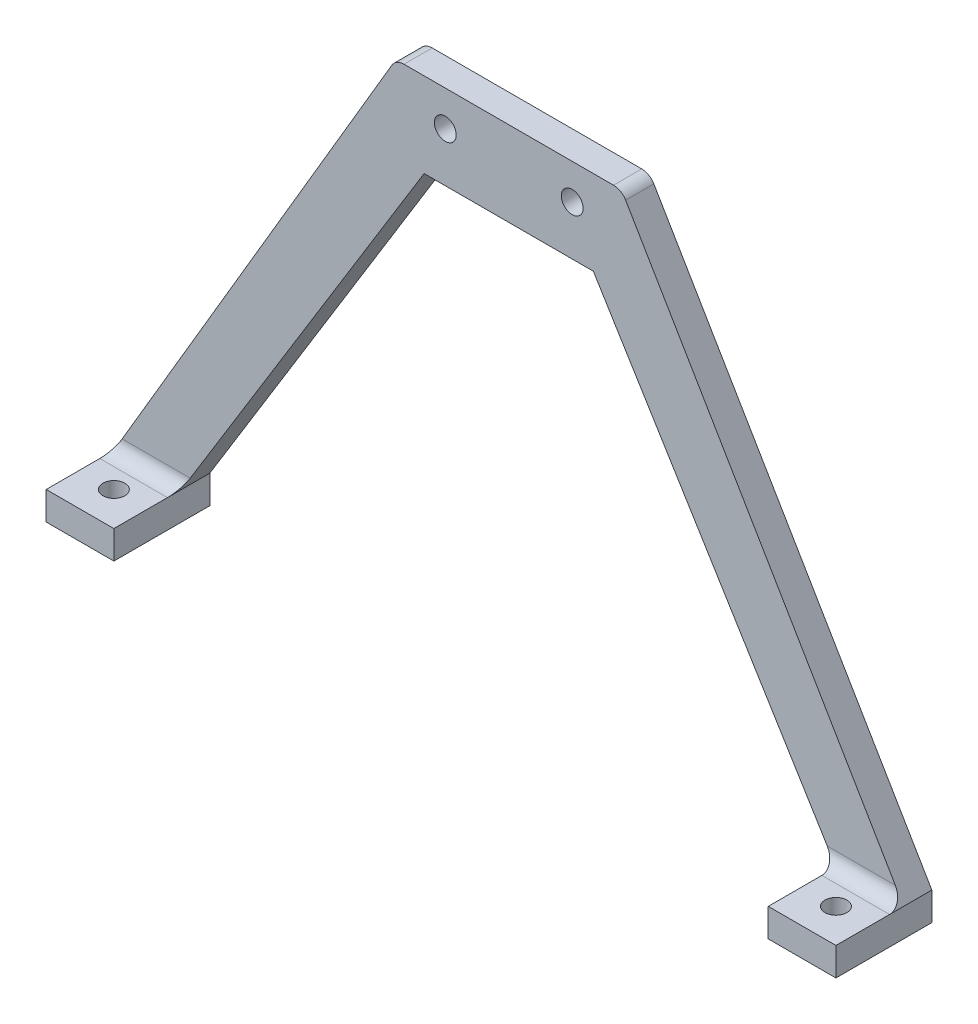
ISO-10303-21;
HEADER;
FILE_DESCRIPTION(('STEP AP214'),'2;1');
FILE_NAME('part.step','',(''),(''),'','','');
FILE_SCHEMA(('AUTOMOTIVE_DESIGN { 1 0 10303 214 1 1 1 1 }'));
ENDSEC;
DATA;
#1=APPLICATION_CONTEXT('core data for automotive mechanical design processes');
#2=APPLICATION_PROTOCOL_DEFINITION('international standard','automotive_design',2000,#1);
#3=PRODUCT_CONTEXT('',#1,'mechanical');
#4=PRODUCT('Part','Part','',(#3));
#5=PRODUCT_RELATED_PRODUCT_CATEGORY('part','',(#4));
#6=PRODUCT_DEFINITION_FORMATION('','',#4);
#7=PRODUCT_DEFINITION_CONTEXT('part definition',#1,'design');
#8=PRODUCT_DEFINITION('design','',#6,#7);
#9=PRODUCT_DEFINITION_SHAPE('','',#8);
#10=(LENGTH_UNIT() NAMED_UNIT(*) SI_UNIT(.MILLI.,.METRE.));
#11=(NAMED_UNIT(*) PLANE_ANGLE_UNIT() SI_UNIT($,.RADIAN.));
#12=(NAMED_UNIT(*) SI_UNIT($,.STERADIAN.) SOLID_ANGLE_UNIT());
#13=UNCERTAINTY_MEASURE_WITH_UNIT(LENGTH_MEASURE(1.E-05),#10,'distance_accuracy_value','');
#14=(GEOMETRIC_REPRESENTATION_CONTEXT(3) GLOBAL_UNCERTAINTY_ASSIGNED_CONTEXT((#13)) GLOBAL_UNIT_ASSIGNED_CONTEXT((#10,
#11,#12)) REPRESENTATION_CONTEXT('',''));
#15=CARTESIAN_POINT('',(0.,0.,0.));
#16=DIRECTION('',(0.,0.,1.));
#17=DIRECTION('',(1.,0.,0.));
#18=AXIS2_PLACEMENT_3D('',#15,#16,#17);
#19=CARTESIAN_POINT('',(0.,-72.,4.));
#20=DIRECTION('',(0.,1.,0.));
#21=DIRECTION('',(0.,0.,1.));
#22=AXIS2_PLACEMENT_3D('',#19,#20,#21);
#23=PLANE('',#22);
#24=CARTESIAN_POINT('',(4.80000000000001,-72.,8.8));
#25=DIRECTION('',(0.,1.,0.));
#26=DIRECTION('',(0.,0.,1.));
#27=AXIS2_PLACEMENT_3D('',#24,#25,#26);
#28=CIRCLE('',#27,1.55);
#29=CARTESIAN_POINT('',(4.80000000000001,-72.,10.35));
#30=VERTEX_POINT('',#29);
#31=EDGE_CURVE('E195',#30,#30,#28,.T.);
#32=ORIENTED_EDGE('',*,*,#31,.T.);
#33=EDGE_LOOP('',(#32));
#34=FACE_BOUND('',#33,.T.);
#35=DIRECTION('',(1.,0.,0.));
#36=VECTOR('',#35,1.);
#37=CARTESIAN_POINT('',(0.,-72.,0.));
#38=LINE('',#37,#36);
#39=CARTESIAN_POINT('',(0.,-72.,0.));
#40=VERTEX_POINT('',#39);
#41=CARTESIAN_POINT('',(9.60000000000001,-72.,0.));
#42=VERTEX_POINT('',#41);
#43=EDGE_CURVE('E188',#40,#42,#38,.T.);
#44=ORIENTED_EDGE('',*,*,#43,.T.);
#45=DIRECTION('',(0.,0.,-1.));
#46=VECTOR('',#45,1.);
#47=CARTESIAN_POINT('',(9.60000000000001,-72.,13.6));
#48=LINE('',#47,#46);
#49=CARTESIAN_POINT('',(9.60000000000001,-72.,13.6));
#50=VERTEX_POINT('',#49);
#51=EDGE_CURVE('E203',#50,#42,#48,.T.);
#52=ORIENTED_EDGE('',*,*,#51,.F.);
#53=DIRECTION('',(1.,0.,0.));
#54=VECTOR('',#53,1.);
#55=CARTESIAN_POINT('',(0.,-72.,13.6));
#56=LINE('',#55,#54);
#57=CARTESIAN_POINT('',(0.,-72.,13.6));
#58=VERTEX_POINT('',#57);
#59=EDGE_CURVE('E217',#58,#50,#56,.T.);
#60=ORIENTED_EDGE('',*,*,#59,.F.);
#61=DIRECTION('',(0.,0.,-1.));
#62=VECTOR('',#61,1.);
#63=CARTESIAN_POINT('',(0.,-72.,4.));
#64=LINE('',#63,#62);
#65=EDGE_CURVE('E194',#58,#40,#64,.T.);
#66=ORIENTED_EDGE('',*,*,#65,.T.);
#67=EDGE_LOOP('',(#44,#52,#60,#66));
#68=FACE_BOUND('',#67,.T.);
#69=ADVANCED_FACE('F33',(#34,#68),#23,.F.);
#70=CARTESIAN_POINT('',(0.,0.,4.));
#71=DIRECTION('',(0.,0.,1.));
#72=DIRECTION('',(1.,0.,0.));
#73=AXIS2_PLACEMENT_3D('',#70,#71,#72);
#74=PLANE('',#73);
#75=DIRECTION('',(0.507020126563394,-0.861934215157769,0.));
#76=VECTOR('',#75,1.);
#77=CARTESIAN_POINT('',(72.,0.,4.));
#78=LINE('',#77,#76);
#79=CARTESIAN_POINT('',(72.5799763216901,-0.985959746873217,4.));
#80=VERTEX_POINT('',#79);
#81=CARTESIAN_POINT('',(110.823529411765,-66.,4.));
#82=VERTEX_POINT('',#81);
#83=EDGE_CURVE('E255',#80,#82,#78,.T.);
#84=ORIENTED_EDGE('',*,*,#83,.F.);
#85=CARTESIAN_POINT('',(70.8561078913746,-2.,4.));
#86=DIRECTION('',(0.,0.,1.));
#87=DIRECTION('',(1.,0.,0.));
#88=AXIS2_PLACEMENT_3D('',#85,#86,#87);
#89=CIRCLE('',#88,2.);
#90=CARTESIAN_POINT('',(70.8561078913746,0.,4.));
#91=VERTEX_POINT('',#90);
#92=EDGE_CURVE('E302',#80,#91,#89,.T.);
#93=ORIENTED_EDGE('',*,*,#92,.T.);
#94=DIRECTION('',(-1.,0.,0.));
#95=VECTOR('',#94,1.);
#96=CARTESIAN_POINT('',(0.,0.,4.));
#97=LINE('',#96,#95);
#98=CARTESIAN_POINT('',(41.1438921086254,0.,4.));
#99=VERTEX_POINT('',#98);
#100=EDGE_CURVE('E200',#91,#99,#97,.T.);
#101=ORIENTED_EDGE('',*,*,#100,.T.);
#102=CARTESIAN_POINT('',(41.1438921086254,-2.,4.));
#103=DIRECTION('',(0.,0.,1.));
#104=DIRECTION('',(1.,0.,0.));
#105=AXIS2_PLACEMENT_3D('',#102,#103,#104);
#106=CIRCLE('',#105,2.);
#107=CARTESIAN_POINT('',(39.4200236783099,-0.98595974687321,4.));
#108=VERTEX_POINT('',#107);
#109=EDGE_CURVE('E300',#99,#108,#106,.T.);
#110=ORIENTED_EDGE('',*,*,#109,.T.);
#111=DIRECTION('',(0.507020126563394,0.86193421515777,0.));
#112=VECTOR('',#111,1.);
#113=CARTESIAN_POINT('',(40.,0.,4.));
#114=LINE('',#113,#112);
#115=CARTESIAN_POINT('',(1.1764705882353,-66.,4.));
#116=VERTEX_POINT('',#115);
#117=EDGE_CURVE('E254',#116,#108,#114,.T.);
#118=ORIENTED_EDGE('',*,*,#117,.F.);
#119=DIRECTION('',(-1.,0.,0.));
#120=VECTOR('',#119,1.);
#121=CARTESIAN_POINT('',(0.,-66.,4.));
#122=LINE('',#121,#120);
#123=CARTESIAN_POINT('',(10.8285714285714,-66.,4.));
#124=VERTEX_POINT('',#123);
#125=EDGE_CURVE('E282',#116,#124,#122,.F.);
#126=ORIENTED_EDGE('',*,*,#125,.T.);
#127=DIRECTION('',(-0.523418105874801,-0.852075986307815,0.));
#128=VECTOR('',#127,1.);
#129=CARTESIAN_POINT('',(9.60000000000001,-68.,4.));
#130=LINE('',#129,#128);
#131=CARTESIAN_POINT('',(44.,-12.,4.));
#132=VERTEX_POINT('',#131);
#133=EDGE_CURVE('E261',#132,#124,#130,.T.);
#134=ORIENTED_EDGE('',*,*,#133,.F.);
#135=DIRECTION('',(-1.,0.,0.));
#136=VECTOR('',#135,1.);
#137=CARTESIAN_POINT('',(44.,-12.,4.));
#138=LINE('',#137,#136);
#139=CARTESIAN_POINT('',(68.,-12.,4.));
#140=VERTEX_POINT('',#139);
#141=EDGE_CURVE('E271',#140,#132,#138,.T.);
#142=ORIENTED_EDGE('',*,*,#141,.F.);
#143=DIRECTION('',(-0.523418105874801,0.852075986307815,0.));
#144=VECTOR('',#143,1.);
#145=CARTESIAN_POINT('',(102.4,-68.,4.));
#146=LINE('',#145,#144);
#147=CARTESIAN_POINT('',(101.171428571429,-66.,4.));
#148=VERTEX_POINT('',#147);
#149=EDGE_CURVE('E267',#148,#140,#146,.T.);
#150=ORIENTED_EDGE('',*,*,#149,.F.);
#151=DIRECTION('',(-1.,0.,0.));
#152=VECTOR('',#151,1.);
#153=CARTESIAN_POINT('',(0.,-66.,4.));
#154=LINE('',#153,#152);
#155=EDGE_CURVE('E284',#148,#82,#154,.F.);
#156=ORIENTED_EDGE('',*,*,#155,.T.);
#157=EDGE_LOOP('',(#84,#93,#101,#110,#118,#126,#134,#142,#150,#156));
#158=FACE_BOUND('',#157,.T.);
#159=CARTESIAN_POINT('',(65.,-5.00000000000001,4.));
#160=DIRECTION('',(0.,0.,1.));
#161=DIRECTION('',(1.,0.,0.));
#162=AXIS2_PLACEMENT_3D('',#159,#160,#161);
#163=CIRCLE('',#162,1.54999999999999);
#164=CARTESIAN_POINT('',(66.55,-5.00000000000001,4.));
#165=VERTEX_POINT('',#164);
#166=EDGE_CURVE('E249',#165,#165,#163,.T.);
#167=ORIENTED_EDGE('',*,*,#166,.F.);
#168=EDGE_LOOP('',(#167));
#169=FACE_BOUND('',#168,.T.);
#170=CARTESIAN_POINT('',(47.,-5.00000000000001,4.));
#171=DIRECTION('',(0.,0.,1.));
#172=DIRECTION('',(1.,0.,0.));
#173=AXIS2_PLACEMENT_3D('',#170,#171,#172);
#174=CIRCLE('',#173,1.55);
#175=CARTESIAN_POINT('',(48.55,-5.00000000000001,4.));
#176=VERTEX_POINT('',#175);
#177=EDGE_CURVE('E246',#176,#176,#174,.T.);
#178=ORIENTED_EDGE('',*,*,#177,.F.);
#179=EDGE_LOOP('',(#178));
#180=FACE_BOUND('',#179,.T.);
#181=ADVANCED_FACE('F319',(#158,#169,#180),#74,.T.);
#182=CARTESIAN_POINT('',(0.,0.,4.));
#183=DIRECTION('',(1.,0.,0.));
#184=DIRECTION('',(0.,1.,0.));
#185=AXIS2_PLACEMENT_3D('',#182,#183,#184);
#186=PLANE('',#185);
#187=DIRECTION('',(0.,0.,-1.));
#188=VECTOR('',#187,1.);
#189=CARTESIAN_POINT('',(0.,-68.,13.6));
#190=LINE('',#189,#188);
#191=CARTESIAN_POINT('',(0.,-68.,13.6));
#192=VERTEX_POINT('',#191);
#193=CARTESIAN_POINT('',(0.,-68.,6.));
#194=VERTEX_POINT('',#193);
#195=EDGE_CURVE('E199',#192,#194,#190,.T.);
#196=ORIENTED_EDGE('',*,*,#195,.T.);
#197=DIRECTION('',(0.,0.,1.));
#198=VECTOR('',#197,1.);
#199=CARTESIAN_POINT('',(0.,-68.,-5.6));
#200=LINE('',#199,#198);
#201=CARTESIAN_POINT('',(0.,-68.,0.));
#202=VERTEX_POINT('',#201);
#203=EDGE_CURVE('E252',#202,#194,#200,.T.);
#204=ORIENTED_EDGE('',*,*,#203,.F.);
#205=DIRECTION('',(0.,-1.,0.));
#206=VECTOR('',#205,1.);
#207=CARTESIAN_POINT('',(0.,0.,0.));
#208=LINE('',#207,#206);
#209=EDGE_CURVE('E196',#202,#40,#208,.T.);
#210=ORIENTED_EDGE('',*,*,#209,.T.);
#211=ORIENTED_EDGE('',*,*,#65,.F.);
#212=DIRECTION('',(0.,-1.,0.));
#213=VECTOR('',#212,1.);
#214=CARTESIAN_POINT('',(0.,-72.,13.6));
#215=LINE('',#214,#213);
#216=EDGE_CURVE('E209',#192,#58,#215,.T.);
#217=ORIENTED_EDGE('',*,*,#216,.F.);
#218=EDGE_LOOP('',(#196,#204,#210,#211,#217));
#219=FACE_BOUND('',#218,.T.);
#220=ADVANCED_FACE('F383',(#219),#186,.F.);
#221=CARTESIAN_POINT('',(107.2,-72.,8.8));
#222=DIRECTION('',(0.,1.,0.));
#223=DIRECTION('',(0.,0.,1.));
#224=AXIS2_PLACEMENT_3D('',#221,#222,#223);
#225=CIRCLE('',#224,1.54999999999999);
#226=CARTESIAN_POINT('',(107.2,-72.,10.35));
#227=VERTEX_POINT('',#226);
#228=EDGE_CURVE('E198',#227,#227,#225,.T.);
#229=ORIENTED_EDGE('',*,*,#228,.T.);
#230=EDGE_LOOP('',(#229));
#231=FACE_BOUND('',#230,.T.);
#232=DIRECTION('',(0.,0.,-1.));
#233=VECTOR('',#232,1.);
#234=CARTESIAN_POINT('',(102.4,-72.,13.6));
#235=LINE('',#234,#233);
#236=CARTESIAN_POINT('',(102.4,-72.,13.6));
#237=VERTEX_POINT('',#236);
#238=CARTESIAN_POINT('',(102.4,-72.,0.));
#239=VERTEX_POINT('',#238);
#240=EDGE_CURVE('E186',#237,#239,#235,.T.);
#241=ORIENTED_EDGE('',*,*,#240,.T.);
#242=CARTESIAN_POINT('',(112.,-72.,0.));
#243=VERTEX_POINT('',#242);
#244=EDGE_CURVE('E184',#239,#243,#38,.T.);
#245=ORIENTED_EDGE('',*,*,#244,.T.);
#246=DIRECTION('',(0.,0.,-1.));
#247=VECTOR('',#246,1.);
#248=CARTESIAN_POINT('',(112.,-72.,4.));
#249=LINE('',#248,#247);
#250=CARTESIAN_POINT('',(112.,-72.,13.6));
#251=VERTEX_POINT('',#250);
#252=EDGE_CURVE('E179',#251,#243,#249,.T.);
#253=ORIENTED_EDGE('',*,*,#252,.F.);
#254=DIRECTION('',(1.,0.,0.));
#255=VECTOR('',#254,1.);
#256=CARTESIAN_POINT('',(102.4,-72.,13.6));
#257=LINE('',#256,#255);
#258=EDGE_CURVE('E232',#237,#251,#257,.T.);
#259=ORIENTED_EDGE('',*,*,#258,.F.);
#260=EDGE_LOOP('',(#241,#245,#253,#259));
#261=FACE_BOUND('',#260,.T.);
#262=ADVANCED_FACE('F341',(#231,#261),#23,.F.);
#263=CARTESIAN_POINT('',(112.,0.,4.));
#264=DIRECTION('',(-1.,0.,0.));
#265=DIRECTION('',(0.,-1.,0.));
#266=AXIS2_PLACEMENT_3D('',#263,#264,#265);
#267=PLANE('',#266);
#268=DIRECTION('',(0.,1.,0.));
#269=VECTOR('',#268,1.);
#270=CARTESIAN_POINT('',(112.,0.,0.));
#271=LINE('',#270,#269);
#272=CARTESIAN_POINT('',(112.,-68.0000000000001,0.));
#273=VERTEX_POINT('',#272);
#274=EDGE_CURVE('E162',#243,#273,#271,.T.);
#275=ORIENTED_EDGE('',*,*,#274,.T.);
#276=DIRECTION('',(0.,0.,1.));
#277=VECTOR('',#276,1.);
#278=CARTESIAN_POINT('',(112.,-68.,-5.6));
#279=LINE('',#278,#277);
#280=CARTESIAN_POINT('',(112.,-68.,6.));
#281=VERTEX_POINT('',#280);
#282=EDGE_CURVE('E171',#273,#281,#279,.T.);
#283=ORIENTED_EDGE('',*,*,#282,.T.);
#284=DIRECTION('',(0.,0.,-1.));
#285=VECTOR('',#284,1.);
#286=CARTESIAN_POINT('',(112.,-68.,13.6));
#287=LINE('',#286,#285);
#288=CARTESIAN_POINT('',(112.,-68.,13.6));
#289=VERTEX_POINT('',#288);
#290=EDGE_CURVE('E222',#289,#281,#287,.T.);
#291=ORIENTED_EDGE('',*,*,#290,.F.);
#292=DIRECTION('',(0.,1.,0.));
#293=VECTOR('',#292,1.);
#294=CARTESIAN_POINT('',(112.,-72.,13.6));
#295=LINE('',#294,#293);
#296=EDGE_CURVE('E230',#251,#289,#295,.T.);
#297=ORIENTED_EDGE('',*,*,#296,.F.);
#298=ORIENTED_EDGE('',*,*,#252,.T.);
#299=EDGE_LOOP('',(#275,#283,#291,#297,#298));
#300=FACE_BOUND('',#299,.T.);
#301=ADVANCED_FACE('F182',(#300),#267,.F.);
#302=CARTESIAN_POINT('',(0.,0.,4.));
#303=DIRECTION('',(0.,-1.,0.));
#304=DIRECTION('',(0.,0.,-1.));
#305=AXIS2_PLACEMENT_3D('',#302,#303,#304);
#306=PLANE('',#305);
#307=ORIENTED_EDGE('',*,*,#100,.F.);
#308=DIRECTION('',(0.,0.,1.));
#309=VECTOR('',#308,1.);
#310=CARTESIAN_POINT('',(70.8561078913746,0.,4.));
#311=LINE('',#310,#309);
#312=CARTESIAN_POINT('',(70.8561078913746,0.,0.));
#313=VERTEX_POINT('',#312);
#314=EDGE_CURVE('E307',#91,#313,#311,.F.);
#315=ORIENTED_EDGE('',*,*,#314,.T.);
#316=DIRECTION('',(-1.,0.,0.));
#317=VECTOR('',#316,1.);
#318=CARTESIAN_POINT('',(0.,0.,0.));
#319=LINE('',#318,#317);
#320=CARTESIAN_POINT('',(41.1438921086254,0.,0.));
#321=VERTEX_POINT('',#320);
#322=EDGE_CURVE('E190',#313,#321,#319,.T.);
#323=ORIENTED_EDGE('',*,*,#322,.T.);
#324=DIRECTION('',(0.,0.,1.));
#325=VECTOR('',#324,1.);
#326=CARTESIAN_POINT('',(41.1438921086254,0.,4.));
#327=LINE('',#326,#325);
#328=EDGE_CURVE('E304',#321,#99,#327,.T.);
#329=ORIENTED_EDGE('',*,*,#328,.T.);
#330=EDGE_LOOP('',(#307,#315,#323,#329));
#331=FACE_BOUND('',#330,.T.);
#332=ADVANCED_FACE('F312',(#331),#306,.F.);
#333=CARTESIAN_POINT('',(0.,0.,0.));
#334=DIRECTION('',(0.,0.,1.));
#335=DIRECTION('',(1.,0.,0.));
#336=AXIS2_PLACEMENT_3D('',#333,#334,#335);
#337=PLANE('',#336);
#338=CARTESIAN_POINT('',(65.,-5.00000000000001,0.));
#339=DIRECTION('',(0.,0.,1.));
#340=DIRECTION('',(1.,0.,0.));
#341=AXIS2_PLACEMENT_3D('',#338,#339,#340);
#342=CIRCLE('',#341,1.54999999999999);
#343=CARTESIAN_POINT('',(66.55,-5.00000000000001,0.));
#344=VERTEX_POINT('',#343);
#345=EDGE_CURVE('E315',#344,#344,#342,.T.);
#346=ORIENTED_EDGE('',*,*,#345,.T.);
#347=EDGE_LOOP('',(#346));
#348=FACE_BOUND('',#347,.T.);
#349=CARTESIAN_POINT('',(47.,-5.00000000000001,0.));
#350=DIRECTION('',(0.,0.,1.));
#351=DIRECTION('',(1.,0.,0.));
#352=AXIS2_PLACEMENT_3D('',#349,#350,#351);
#353=CIRCLE('',#352,1.55);
#354=CARTESIAN_POINT('',(48.55,-5.00000000000001,0.));
#355=VERTEX_POINT('',#354);
#356=EDGE_CURVE('E345',#355,#355,#353,.T.);
#357=ORIENTED_EDGE('',*,*,#356,.T.);
#358=EDGE_LOOP('',(#357));
#359=FACE_BOUND('',#358,.T.);
#360=ORIENTED_EDGE('',*,*,#322,.F.);
#361=CARTESIAN_POINT('',(70.8561078913746,-2.,0.));
#362=DIRECTION('',(0.,0.,1.));
#363=DIRECTION('',(1.,0.,0.));
#364=AXIS2_PLACEMENT_3D('',#361,#362,#363);
#365=CIRCLE('',#364,2.);
#366=CARTESIAN_POINT('',(72.5799763216901,-0.985959746873238,0.));
#367=VERTEX_POINT('',#366);
#368=EDGE_CURVE('E41',#313,#367,#365,.F.);
#369=ORIENTED_EDGE('',*,*,#368,.T.);
#370=DIRECTION('',(0.507020126563394,-0.86193421515777,0.));
#371=VECTOR('',#370,1.);
#372=CARTESIAN_POINT('',(53.4910025706941,31.46529562982,0.));
#373=LINE('',#372,#371);
#374=EDGE_CURVE('E157',#367,#273,#373,.T.);
#375=ORIENTED_EDGE('',*,*,#374,.T.);
#376=ORIENTED_EDGE('',*,*,#274,.F.);
#377=ORIENTED_EDGE('',*,*,#244,.F.);
#378=DIRECTION('',(0.,1.,0.));
#379=VECTOR('',#378,1.);
#380=CARTESIAN_POINT('',(102.4,0.,0.));
#381=LINE('',#380,#379);
#382=CARTESIAN_POINT('',(102.4,-68.,0.));
#383=VERTEX_POINT('',#382);
#384=EDGE_CURVE('E167',#239,#383,#381,.T.);
#385=ORIENTED_EDGE('',*,*,#384,.T.);
#386=DIRECTION('',(-0.523418105874801,0.852075986307815,0.));
#387=VECTOR('',#386,1.);
#388=CARTESIAN_POINT('',(44.01837309231,27.0398577567047,0.));
#389=LINE('',#388,#387);
#390=CARTESIAN_POINT('',(68.,-12.,0.));
#391=VERTEX_POINT('',#390);
#392=EDGE_CURVE('E277',#383,#391,#389,.T.);
#393=ORIENTED_EDGE('',*,*,#392,.T.);
#394=DIRECTION('',(-1.,0.,0.));
#395=VECTOR('',#394,1.);
#396=CARTESIAN_POINT('',(0.,-12.,0.));
#397=LINE('',#396,#395);
#398=CARTESIAN_POINT('',(44.,-12.,0.));
#399=VERTEX_POINT('',#398);
#400=EDGE_CURVE('E273',#391,#399,#397,.T.);
#401=ORIENTED_EDGE('',*,*,#400,.T.);
#402=DIRECTION('',(-0.523418105874801,-0.852075986307815,0.));
#403=VECTOR('',#402,1.);
#404=CARTESIAN_POINT('',(37.2973773892429,-22.9112461105349,0.));
#405=LINE('',#404,#403);
#406=CARTESIAN_POINT('',(9.60000000000001,-68.,0.));
#407=VERTEX_POINT('',#406);
#408=EDGE_CURVE('E276',#399,#407,#405,.T.);
#409=ORIENTED_EDGE('',*,*,#408,.T.);
#410=DIRECTION('',(0.,-1.,0.));
#411=VECTOR('',#410,1.);
#412=CARTESIAN_POINT('',(9.60000000000001,0.,0.));
#413=LINE('',#412,#411);
#414=EDGE_CURVE('E350',#407,#42,#413,.T.);
#415=ORIENTED_EDGE('',*,*,#414,.T.);
#416=ORIENTED_EDGE('',*,*,#43,.F.);
#417=ORIENTED_EDGE('',*,*,#209,.F.);
#418=DIRECTION('',(0.507020126563394,0.86193421515777,0.));
#419=VECTOR('',#418,1.);
#420=CARTESIAN_POINT('',(29.7172236503856,-17.4807197943445,0.));
#421=LINE('',#420,#419);
#422=CARTESIAN_POINT('',(39.4200236783099,-0.9859597468732,0.));
#423=VERTEX_POINT('',#422);
#424=EDGE_CURVE('E168',#202,#423,#421,.T.);
#425=ORIENTED_EDGE('',*,*,#424,.T.);
#426=CARTESIAN_POINT('',(41.1438921086254,-2.,0.));
#427=DIRECTION('',(0.,0.,1.));
#428=DIRECTION('',(1.,0.,0.));
#429=AXIS2_PLACEMENT_3D('',#426,#427,#428);
#430=CIRCLE('',#429,2.);
#431=EDGE_CURVE('E53',#423,#321,#430,.F.);
#432=ORIENTED_EDGE('',*,*,#431,.T.);
#433=EDGE_LOOP('',(#360,#369,#375,#376,#377,#385,#393,#401,#409,#415,#416,#417,#425,#432));
#434=FACE_BOUND('',#433,.T.);
#435=ADVANCED_FACE('F159',(#348,#359,#434),#337,.F.);
#436=CARTESIAN_POINT('',(9.60000000000001,-72.,13.6));
#437=DIRECTION('',(-1.,0.,0.));
#438=DIRECTION('',(0.,0.,1.));
#439=AXIS2_PLACEMENT_3D('',#436,#437,#438);
#440=PLANE('',#439);
#441=ORIENTED_EDGE('',*,*,#51,.T.);
#442=ORIENTED_EDGE('',*,*,#414,.F.);
#443=DIRECTION('',(0.,0.,1.));
#444=VECTOR('',#443,1.);
#445=CARTESIAN_POINT('',(9.60000000000001,-68.,-5.6));
#446=LINE('',#445,#444);
#447=CARTESIAN_POINT('',(9.60000000000001,-68.,6.));
#448=VERTEX_POINT('',#447);
#449=EDGE_CURVE('E205',#407,#448,#446,.T.);
#450=ORIENTED_EDGE('',*,*,#449,.T.);
#451=DIRECTION('',(0.,0.,-1.));
#452=VECTOR('',#451,1.);
#453=CARTESIAN_POINT('',(9.60000000000001,-68.,13.6));
#454=LINE('',#453,#452);
#455=CARTESIAN_POINT('',(9.60000000000001,-68.,13.6));
#456=VERTEX_POINT('',#455);
#457=EDGE_CURVE('E206',#456,#448,#454,.T.);
#458=ORIENTED_EDGE('',*,*,#457,.F.);
#459=DIRECTION('',(0.,1.,0.));
#460=VECTOR('',#459,1.);
#461=CARTESIAN_POINT('',(9.60000000000001,-72.,13.6));
#462=LINE('',#461,#460);
#463=EDGE_CURVE('E215',#50,#456,#462,.T.);
#464=ORIENTED_EDGE('',*,*,#463,.F.);
#465=EDGE_LOOP('',(#441,#442,#450,#458,#464));
#466=FACE_BOUND('',#465,.T.);
#467=ADVANCED_FACE('F391',(#466),#440,.F.);
#468=CARTESIAN_POINT('',(0.,-68.,13.6));
#469=DIRECTION('',(0.,-1.,0.));
#470=DIRECTION('',(0.,0.,-1.));
#471=AXIS2_PLACEMENT_3D('',#468,#469,#470);
#472=PLANE('',#471);
#473=CARTESIAN_POINT('',(4.80000000000001,-68.,8.8));
#474=DIRECTION('',(0.,1.,0.));
#475=DIRECTION('',(0.,0.,1.));
#476=AXIS2_PLACEMENT_3D('',#473,#474,#475);
#477=CIRCLE('',#476,1.55);
#478=CARTESIAN_POINT('',(4.80000000000001,-68.,10.35));
#479=VERTEX_POINT('',#478);
#480=EDGE_CURVE('E229',#479,#479,#477,.T.);
#481=ORIENTED_EDGE('',*,*,#480,.F.);
#482=EDGE_LOOP('',(#481));
#483=FACE_BOUND('',#482,.T.);
#484=ORIENTED_EDGE('',*,*,#457,.T.);
#485=DIRECTION('',(-1.,0.,0.));
#486=VECTOR('',#485,1.);
#487=CARTESIAN_POINT('',(0.,-68.,6.));
#488=LINE('',#487,#486);
#489=EDGE_CURVE('E287',#448,#194,#488,.T.);
#490=ORIENTED_EDGE('',*,*,#489,.T.);
#491=ORIENTED_EDGE('',*,*,#195,.F.);
#492=DIRECTION('',(-1.,0.,0.));
#493=VECTOR('',#492,1.);
#494=CARTESIAN_POINT('',(0.,-68.,13.6));
#495=LINE('',#494,#493);
#496=EDGE_CURVE('E212',#456,#192,#495,.T.);
#497=ORIENTED_EDGE('',*,*,#496,.F.);
#498=EDGE_LOOP('',(#484,#490,#491,#497));
#499=FACE_BOUND('',#498,.T.);
#500=ADVANCED_FACE('F377',(#483,#499),#472,.F.);
#501=CARTESIAN_POINT('',(0.,0.,13.6));
#502=DIRECTION('',(0.,0.,-1.));
#503=DIRECTION('',(-1.,0.,0.));
#504=AXIS2_PLACEMENT_3D('',#501,#502,#503);
#505=PLANE('',#504);
#506=ORIENTED_EDGE('',*,*,#216,.T.);
#507=ORIENTED_EDGE('',*,*,#59,.T.);
#508=ORIENTED_EDGE('',*,*,#463,.T.);
#509=ORIENTED_EDGE('',*,*,#496,.T.);
#510=EDGE_LOOP('',(#506,#507,#508,#509));
#511=FACE_BOUND('',#510,.T.);
#512=ADVANCED_FACE('F387',(#511),#505,.F.);
#513=CARTESIAN_POINT('',(102.4,-72.,13.6));
#514=DIRECTION('',(1.,0.,0.));
#515=DIRECTION('',(0.,0.,-1.));
#516=AXIS2_PLACEMENT_3D('',#513,#514,#515);
#517=PLANE('',#516);
#518=DIRECTION('',(0.,0.,-1.));
#519=VECTOR('',#518,1.);
#520=CARTESIAN_POINT('',(102.4,-68.,13.6));
#521=LINE('',#520,#519);
#522=CARTESIAN_POINT('',(102.4,-68.,13.6));
#523=VERTEX_POINT('',#522);
#524=CARTESIAN_POINT('',(102.4,-68.,6.));
#525=VERTEX_POINT('',#524);
#526=EDGE_CURVE('E214',#523,#525,#521,.T.);
#527=ORIENTED_EDGE('',*,*,#526,.T.);
#528=DIRECTION('',(0.,0.,1.));
#529=VECTOR('',#528,1.);
#530=CARTESIAN_POINT('',(102.4,-68.,-5.6));
#531=LINE('',#530,#529);
#532=EDGE_CURVE('E265',#383,#525,#531,.T.);
#533=ORIENTED_EDGE('',*,*,#532,.F.);
#534=ORIENTED_EDGE('',*,*,#384,.F.);
#535=ORIENTED_EDGE('',*,*,#240,.F.);
#536=DIRECTION('',(0.,-1.,0.));
#537=VECTOR('',#536,1.);
#538=CARTESIAN_POINT('',(102.4,-72.,13.6));
#539=LINE('',#538,#537);
#540=EDGE_CURVE('E224',#523,#237,#539,.T.);
#541=ORIENTED_EDGE('',*,*,#540,.F.);
#542=EDGE_LOOP('',(#527,#533,#534,#535,#541));
#543=FACE_BOUND('',#542,.T.);
#544=ADVANCED_FACE('F334',(#543),#517,.F.);
#545=CARTESIAN_POINT('',(102.4,-68.,13.6));
#546=DIRECTION('',(0.,-1.,0.));
#547=DIRECTION('',(0.,0.,-1.));
#548=AXIS2_PLACEMENT_3D('',#545,#546,#547);
#549=PLANE('',#548);
#550=CARTESIAN_POINT('',(107.2,-68.,8.8));
#551=DIRECTION('',(0.,1.,0.));
#552=DIRECTION('',(0.,0.,1.));
#553=AXIS2_PLACEMENT_3D('',#550,#551,#552);
#554=CIRCLE('',#553,1.54999999999999);
#555=CARTESIAN_POINT('',(107.2,-68.,10.35));
#556=VERTEX_POINT('',#555);
#557=EDGE_CURVE('E241',#556,#556,#554,.T.);
#558=ORIENTED_EDGE('',*,*,#557,.F.);
#559=EDGE_LOOP('',(#558));
#560=FACE_BOUND('',#559,.T.);
#561=ORIENTED_EDGE('',*,*,#290,.T.);
#562=DIRECTION('',(-1.,0.,0.));
#563=VECTOR('',#562,1.);
#564=CARTESIAN_POINT('',(102.4,-68.,6.));
#565=LINE('',#564,#563);
#566=EDGE_CURVE('E279',#281,#525,#565,.T.);
#567=ORIENTED_EDGE('',*,*,#566,.T.);
#568=ORIENTED_EDGE('',*,*,#526,.F.);
#569=DIRECTION('',(-1.,0.,0.));
#570=VECTOR('',#569,1.);
#571=CARTESIAN_POINT('',(102.4,-68.,13.6));
#572=LINE('',#571,#570);
#573=EDGE_CURVE('E227',#289,#523,#572,.T.);
#574=ORIENTED_EDGE('',*,*,#573,.F.);
#575=EDGE_LOOP('',(#561,#567,#568,#574));
#576=FACE_BOUND('',#575,.T.);
#577=ADVANCED_FACE('F329',(#560,#576),#549,.F.);
#578=CARTESIAN_POINT('',(0.,0.,13.6));
#579=DIRECTION('',(0.,0.,-1.));
#580=DIRECTION('',(-1.,0.,0.));
#581=AXIS2_PLACEMENT_3D('',#578,#579,#580);
#582=PLANE('',#581);
#583=ORIENTED_EDGE('',*,*,#540,.T.);
#584=ORIENTED_EDGE('',*,*,#258,.T.);
#585=ORIENTED_EDGE('',*,*,#296,.T.);
#586=ORIENTED_EDGE('',*,*,#573,.T.);
#587=EDGE_LOOP('',(#583,#584,#585,#586));
#588=FACE_BOUND('',#587,.T.);
#589=ADVANCED_FACE('F339',(#588),#582,.F.);
#590=CARTESIAN_POINT('',(4.80000000000001,-77.6,8.8));
#591=DIRECTION('',(0.,1.,0.));
#592=DIRECTION('',(0.,0.,1.));
#593=AXIS2_PLACEMENT_3D('',#590,#591,#592);
#594=CYLINDRICAL_SURFACE('',#593,1.55);
#595=ORIENTED_EDGE('',*,*,#480,.T.);
#596=EDGE_LOOP('',(#595));
#597=FACE_BOUND('',#596,.T.);
#598=ORIENTED_EDGE('',*,*,#31,.F.);
#599=EDGE_LOOP('',(#598));
#600=FACE_BOUND('',#599,.T.);
#601=ADVANCED_FACE('F417',(#597,#600),#594,.F.);
#602=CARTESIAN_POINT('',(107.2,-77.6,8.8));
#603=DIRECTION('',(0.,1.,0.));
#604=DIRECTION('',(0.,0.,1.));
#605=AXIS2_PLACEMENT_3D('',#602,#603,#604);
#606=CYLINDRICAL_SURFACE('',#605,1.54999999999999);
#607=ORIENTED_EDGE('',*,*,#557,.T.);
#608=EDGE_LOOP('',(#607));
#609=FACE_BOUND('',#608,.T.);
#610=ORIENTED_EDGE('',*,*,#228,.F.);
#611=EDGE_LOOP('',(#610));
#612=FACE_BOUND('',#611,.T.);
#613=ADVANCED_FACE('F414',(#609,#612),#606,.F.);
#614=CARTESIAN_POINT('',(47.,-5.00000000000001,-5.6));
#615=DIRECTION('',(0.,0.,1.));
#616=DIRECTION('',(1.,0.,0.));
#617=AXIS2_PLACEMENT_3D('',#614,#615,#616);
#618=CYLINDRICAL_SURFACE('',#617,1.55);
#619=ORIENTED_EDGE('',*,*,#177,.T.);
#620=EDGE_LOOP('',(#619));
#621=FACE_BOUND('',#620,.T.);
#622=ORIENTED_EDGE('',*,*,#356,.F.);
#623=EDGE_LOOP('',(#622));
#624=FACE_BOUND('',#623,.T.);
#625=ADVANCED_FACE('F416',(#621,#624),#618,.F.);
#626=CARTESIAN_POINT('',(65.,-5.00000000000001,-5.6));
#627=DIRECTION('',(0.,0.,1.));
#628=DIRECTION('',(1.,0.,0.));
#629=AXIS2_PLACEMENT_3D('',#626,#627,#628);
#630=CYLINDRICAL_SURFACE('',#629,1.54999999999999);
#631=ORIENTED_EDGE('',*,*,#166,.T.);
#632=EDGE_LOOP('',(#631));
#633=FACE_BOUND('',#632,.T.);
#634=ORIENTED_EDGE('',*,*,#345,.F.);
#635=EDGE_LOOP('',(#634));
#636=FACE_BOUND('',#635,.T.);
#637=ADVANCED_FACE('F424',(#633,#636),#630,.F.);
#638=CARTESIAN_POINT('',(40.,0.,-5.6));
#639=DIRECTION('',(0.861934215157769,-0.507020126563394,0.));
#640=DIRECTION('',(0.507020126563394,0.86193421515777,0.));
#641=AXIS2_PLACEMENT_3D('',#638,#639,#640);
#642=PLANE('',#641);
#643=ORIENTED_EDGE('',*,*,#117,.T.);
#644=DIRECTION('',(0.,0.,1.));
#645=VECTOR('',#644,1.);
#646=CARTESIAN_POINT('',(39.4200236783099,-0.985959746873211,-5.6));
#647=LINE('',#646,#645);
#648=EDGE_CURVE('E11',#108,#423,#647,.F.);
#649=ORIENTED_EDGE('',*,*,#648,.T.);
#650=ORIENTED_EDGE('',*,*,#424,.F.);
#651=ORIENTED_EDGE('',*,*,#203,.T.);
#652=CARTESIAN_POINT('',(1.17647058823531,-66.,6.));
#653=DIRECTION('',(0.861934215157769,-0.507020126563394,0.));
#654=DIRECTION('',(-0.507020126563394,-0.86193421515777,0.));
#655=AXIS2_PLACEMENT_3D('',#652,#653,#654);
#656=ELLIPSE('',#655,2.32036269686071,2.);
#657=EDGE_CURVE('E293',#194,#116,#656,.T.);
#658=ORIENTED_EDGE('',*,*,#657,.T.);
#659=EDGE_LOOP('',(#643,#649,#650,#651,#658));
#660=FACE_BOUND('',#659,.T.);
#661=ADVANCED_FACE('F433',(#660),#642,.F.);
#662=CARTESIAN_POINT('',(72.,0.,-5.6));
#663=DIRECTION('',(-0.861934215157769,-0.507020126563394,0.));
#664=DIRECTION('',(0.507020126563394,-0.86193421515777,0.));
#665=AXIS2_PLACEMENT_3D('',#662,#663,#664);
#666=PLANE('',#665);
#667=ORIENTED_EDGE('',*,*,#374,.F.);
#668=DIRECTION('',(0.,0.,1.));
#669=VECTOR('',#668,1.);
#670=CARTESIAN_POINT('',(72.5799763216901,-0.985959746873216,-5.6));
#671=LINE('',#670,#669);
#672=EDGE_CURVE('E298',#367,#80,#671,.T.);
#673=ORIENTED_EDGE('',*,*,#672,.T.);
#674=ORIENTED_EDGE('',*,*,#83,.T.);
#675=CARTESIAN_POINT('',(110.823529411765,-66.,6.));
#676=DIRECTION('',(-0.861934215157769,-0.507020126563394,0.));
#677=DIRECTION('',(-0.507020126563394,0.86193421515777,0.));
#678=AXIS2_PLACEMENT_3D('',#675,#676,#677);
#679=ELLIPSE('',#678,2.32036269686071,2.);
#680=EDGE_CURVE('E174',#82,#281,#679,.T.);
#681=ORIENTED_EDGE('',*,*,#680,.T.);
#682=ORIENTED_EDGE('',*,*,#282,.F.);
#683=EDGE_LOOP('',(#667,#673,#674,#681,#682));
#684=FACE_BOUND('',#683,.T.);
#685=ADVANCED_FACE('F172',(#684),#666,.F.);
#686=CARTESIAN_POINT('',(9.60000000000001,-68.,-5.6));
#687=DIRECTION('',(-0.852075986307815,0.523418105874801,0.));
#688=DIRECTION('',(-0.523418105874801,-0.852075986307815,0.));
#689=AXIS2_PLACEMENT_3D('',#686,#687,#688);
#690=PLANE('',#689);
#691=DIRECTION('',(0.,0.,1.));
#692=VECTOR('',#691,1.);
#693=CARTESIAN_POINT('',(44.,-12.,-5.6));
#694=LINE('',#693,#692);
#695=EDGE_CURVE('E258',#399,#132,#694,.T.);
#696=ORIENTED_EDGE('',*,*,#695,.T.);
#697=ORIENTED_EDGE('',*,*,#133,.T.);
#698=CARTESIAN_POINT('',(10.8285714285714,-66.,6.));
#699=DIRECTION('',(-0.852075986307815,0.523418105874801,0.));
#700=DIRECTION('',(-0.523418105874801,-0.852075986307815,0.));
#701=AXIS2_PLACEMENT_3D('',#698,#699,#700);
#702=ELLIPSE('',#701,2.34720850269039,2.);
#703=EDGE_CURVE('E295',#124,#448,#702,.T.);
#704=ORIENTED_EDGE('',*,*,#703,.T.);
#705=ORIENTED_EDGE('',*,*,#449,.F.);
#706=ORIENTED_EDGE('',*,*,#408,.F.);
#707=EDGE_LOOP('',(#696,#697,#704,#705,#706));
#708=FACE_BOUND('',#707,.T.);
#709=ADVANCED_FACE('F369',(#708),#690,.F.);
#710=CARTESIAN_POINT('',(102.4,-68.,-5.6));
#711=DIRECTION('',(0.852075986307815,0.523418105874801,0.));
#712=DIRECTION('',(-0.523418105874801,0.852075986307815,0.));
#713=AXIS2_PLACEMENT_3D('',#710,#711,#712);
#714=PLANE('',#713);
#715=ORIENTED_EDGE('',*,*,#532,.T.);
#716=CARTESIAN_POINT('',(101.171428571429,-66.,6.));
#717=DIRECTION('',(0.852075986307815,0.523418105874801,0.));
#718=DIRECTION('',(-0.523418105874801,0.852075986307815,0.));
#719=AXIS2_PLACEMENT_3D('',#716,#717,#718);
#720=ELLIPSE('',#719,2.34720850269039,2.);
#721=EDGE_CURVE('E290',#525,#148,#720,.T.);
#722=ORIENTED_EDGE('',*,*,#721,.T.);
#723=ORIENTED_EDGE('',*,*,#149,.T.);
#724=DIRECTION('',(0.,0.,1.));
#725=VECTOR('',#724,1.);
#726=CARTESIAN_POINT('',(68.,-12.,-5.6));
#727=LINE('',#726,#725);
#728=EDGE_CURVE('E268',#391,#140,#727,.T.);
#729=ORIENTED_EDGE('',*,*,#728,.F.);
#730=ORIENTED_EDGE('',*,*,#392,.F.);
#731=EDGE_LOOP('',(#715,#722,#723,#729,#730));
#732=FACE_BOUND('',#731,.T.);
#733=ADVANCED_FACE('F361',(#732),#714,.F.);
#734=CARTESIAN_POINT('',(44.,-12.,-6.));
#735=DIRECTION('',(0.,1.,0.));
#736=DIRECTION('',(0.,0.,1.));
#737=AXIS2_PLACEMENT_3D('',#734,#735,#736);
#738=PLANE('',#737);
#739=ORIENTED_EDGE('',*,*,#728,.T.);
#740=ORIENTED_EDGE('',*,*,#141,.T.);
#741=ORIENTED_EDGE('',*,*,#695,.F.);
#742=ORIENTED_EDGE('',*,*,#400,.F.);
#743=EDGE_LOOP('',(#739,#740,#741,#742));
#744=FACE_BOUND('',#743,.T.);
#745=ADVANCED_FACE('F363',(#744),#738,.F.);
#746=CARTESIAN_POINT('',(102.4,-66.,6.));
#747=DIRECTION('',(-1.,0.,0.));
#748=DIRECTION('',(0.,0.,1.));
#749=AXIS2_PLACEMENT_3D('',#746,#747,#748);
#750=CYLINDRICAL_SURFACE('',#749,2.);
#751=ORIENTED_EDGE('',*,*,#680,.F.);
#752=ORIENTED_EDGE('',*,*,#155,.F.);
#753=ORIENTED_EDGE('',*,*,#721,.F.);
#754=ORIENTED_EDGE('',*,*,#566,.F.);
#755=EDGE_LOOP('',(#751,#752,#753,#754));
#756=FACE_BOUND('',#755,.T.);
#757=ADVANCED_FACE('F326',(#756),#750,.F.);
#758=CARTESIAN_POINT('',(0.,-66.,6.));
#759=DIRECTION('',(-1.,0.,0.));
#760=DIRECTION('',(0.,0.,1.));
#761=AXIS2_PLACEMENT_3D('',#758,#759,#760);
#762=CYLINDRICAL_SURFACE('',#761,2.);
#763=ORIENTED_EDGE('',*,*,#703,.F.);
#764=ORIENTED_EDGE('',*,*,#125,.F.);
#765=ORIENTED_EDGE('',*,*,#657,.F.);
#766=ORIENTED_EDGE('',*,*,#489,.F.);
#767=EDGE_LOOP('',(#763,#764,#765,#766));
#768=FACE_BOUND('',#767,.T.);
#769=ADVANCED_FACE('F373',(#768),#762,.F.);
#770=CARTESIAN_POINT('',(70.8561078913746,-2.,-5.6));
#771=DIRECTION('',(0.,0.,1.));
#772=DIRECTION('',(1.,0.,0.));
#773=AXIS2_PLACEMENT_3D('',#770,#771,#772);
#774=CYLINDRICAL_SURFACE('',#773,2.);
#775=ORIENTED_EDGE('',*,*,#368,.F.);
#776=ORIENTED_EDGE('',*,*,#314,.F.);
#777=ORIENTED_EDGE('',*,*,#92,.F.);
#778=ORIENTED_EDGE('',*,*,#672,.F.);
#779=EDGE_LOOP('',(#775,#776,#777,#778));
#780=FACE_BOUND('',#779,.T.);
#781=ADVANCED_FACE('F316',(#780),#774,.T.);
#782=CARTESIAN_POINT('',(41.1438921086254,-2.,4.));
#783=DIRECTION('',(0.,0.,1.));
#784=DIRECTION('',(1.,0.,0.));
#785=AXIS2_PLACEMENT_3D('',#782,#783,#784);
#786=CYLINDRICAL_SURFACE('',#785,2.);
#787=ORIENTED_EDGE('',*,*,#431,.F.);
#788=ORIENTED_EDGE('',*,*,#648,.F.);
#789=ORIENTED_EDGE('',*,*,#109,.F.);
#790=ORIENTED_EDGE('',*,*,#328,.F.);
#791=EDGE_LOOP('',(#787,#788,#789,#790));
#792=FACE_BOUND('',#791,.T.);
#793=ADVANCED_FACE('F35',(#792),#786,.T.);
#794=CLOSED_SHELL('',(#69,#181,#220,#262,#301,#332,#435,#467,#500,#512,#544,#577,#589,#601,#613,
#625,#637,#661,#685,#709,#733,#745,#757,#769,#781,#793));
#795=MANIFOLD_SOLID_BREP('B2',#794);
#796=ADVANCED_BREP_SHAPE_REPRESENTATION('',(#18,#795),#14);
#797=SHAPE_DEFINITION_REPRESENTATION(#9,#796);
ENDSEC;
END-ISO-10303-21;
